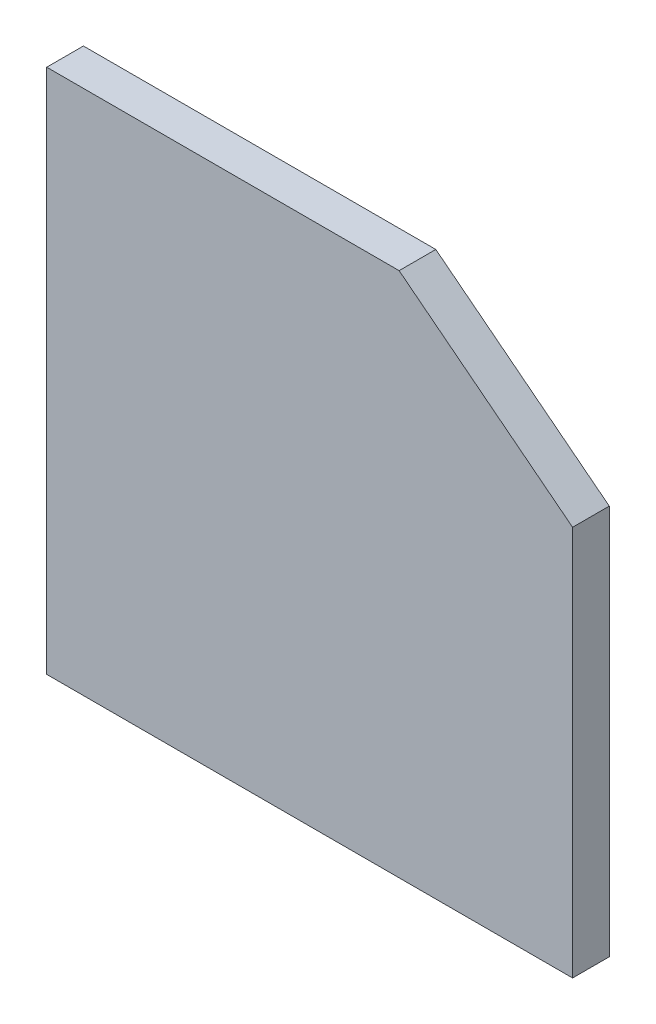
ISO-10303-21;
HEADER;
FILE_DESCRIPTION(('STEP AP214'),'2;1');
FILE_NAME('part.step','',(''),(''),'','','');
FILE_SCHEMA(('AUTOMOTIVE_DESIGN { 1 0 10303 214 1 1 1 1 }'));
ENDSEC;
DATA;
#1=APPLICATION_CONTEXT('core data for automotive mechanical design processes');
#2=APPLICATION_PROTOCOL_DEFINITION('international standard','automotive_design',2000,#1);
#3=PRODUCT_CONTEXT('',#1,'mechanical');
#4=PRODUCT('Part','Part','',(#3));
#5=PRODUCT_RELATED_PRODUCT_CATEGORY('part','',(#4));
#6=PRODUCT_DEFINITION_FORMATION('','',#4);
#7=PRODUCT_DEFINITION_CONTEXT('part definition',#1,'design');
#8=PRODUCT_DEFINITION('design','',#6,#7);
#9=PRODUCT_DEFINITION_SHAPE('','',#8);
#10=(LENGTH_UNIT() NAMED_UNIT(*) SI_UNIT(.MILLI.,.METRE.));
#11=(NAMED_UNIT(*) PLANE_ANGLE_UNIT() SI_UNIT($,.RADIAN.));
#12=(NAMED_UNIT(*) SI_UNIT($,.STERADIAN.) SOLID_ANGLE_UNIT());
#13=UNCERTAINTY_MEASURE_WITH_UNIT(LENGTH_MEASURE(1.E-05),#10,'distance_accuracy_value','');
#14=(GEOMETRIC_REPRESENTATION_CONTEXT(3) GLOBAL_UNCERTAINTY_ASSIGNED_CONTEXT((#13)) GLOBAL_UNIT_ASSIGNED_CONTEXT((#10,
#11,#12)) REPRESENTATION_CONTEXT('',''));
#15=CARTESIAN_POINT('',(0.,0.,0.));
#16=DIRECTION('',(0.,0.,1.));
#17=DIRECTION('',(1.,0.,0.));
#18=AXIS2_PLACEMENT_3D('',#15,#16,#17);
#19=CARTESIAN_POINT('',(0.,0.,3.));
#20=DIRECTION('',(0.,1.,0.));
#21=DIRECTION('',(0.,0.,1.));
#22=AXIS2_PLACEMENT_3D('',#19,#20,#21);
#23=PLANE('',#22);
#24=DIRECTION('',(1.,0.,0.));
#25=VECTOR('',#24,1.);
#26=CARTESIAN_POINT('',(0.,0.,0.));
#27=LINE('',#26,#25);
#28=CARTESIAN_POINT('',(0.,0.,0.));
#29=VERTEX_POINT('',#28);
#30=CARTESIAN_POINT('',(43.,0.,0.));
#31=VERTEX_POINT('',#30);
#32=EDGE_CURVE('E113',#29,#31,#27,.T.);
#33=ORIENTED_EDGE('',*,*,#32,.T.);
#34=DIRECTION('',(0.,0.,-1.));
#35=VECTOR('',#34,1.);
#36=CARTESIAN_POINT('',(43.,0.,3.));
#37=LINE('',#36,#35);
#38=CARTESIAN_POINT('',(43.,0.,3.));
#39=VERTEX_POINT('',#38);
#40=EDGE_CURVE('E11',#39,#31,#37,.T.);
#41=ORIENTED_EDGE('',*,*,#40,.F.);
#42=DIRECTION('',(1.,0.,0.));
#43=VECTOR('',#42,1.);
#44=CARTESIAN_POINT('',(0.,0.,3.));
#45=LINE('',#44,#43);
#46=CARTESIAN_POINT('',(0.,0.,3.));
#47=VERTEX_POINT('',#46);
#48=EDGE_CURVE('E124',#47,#39,#45,.T.);
#49=ORIENTED_EDGE('',*,*,#48,.F.);
#50=DIRECTION('',(0.,0.,-1.));
#51=VECTOR('',#50,1.);
#52=CARTESIAN_POINT('',(0.,0.,3.));
#53=LINE('',#52,#51);
#54=EDGE_CURVE('E55',#47,#29,#53,.T.);
#55=ORIENTED_EDGE('',*,*,#54,.T.);
#56=EDGE_LOOP('',(#33,#41,#49,#55));
#57=FACE_BOUND('',#56,.T.);
#58=ADVANCED_FACE('F39',(#57),#23,.F.);
#59=CARTESIAN_POINT('',(43.,0.,3.));
#60=DIRECTION('',(-1.,0.,0.));
#61=DIRECTION('',(0.,0.,1.));
#62=AXIS2_PLACEMENT_3D('',#59,#60,#61);
#63=PLANE('',#62);
#64=DIRECTION('',(0.,1.,0.));
#65=VECTOR('',#64,1.);
#66=CARTESIAN_POINT('',(43.,0.,0.));
#67=LINE('',#66,#65);
#68=CARTESIAN_POINT('',(43.,31.9180934441381,0.));
#69=VERTEX_POINT('',#68);
#70=EDGE_CURVE('E115',#31,#69,#67,.T.);
#71=ORIENTED_EDGE('',*,*,#70,.T.);
#72=DIRECTION('',(0.,0.,-1.));
#73=VECTOR('',#72,1.);
#74=CARTESIAN_POINT('',(43.,31.9180934441381,3.));
#75=LINE('',#74,#73);
#76=CARTESIAN_POINT('',(43.,31.9180934441381,3.));
#77=VERTEX_POINT('',#76);
#78=EDGE_CURVE('E47',#77,#69,#75,.T.);
#79=ORIENTED_EDGE('',*,*,#78,.F.);
#80=DIRECTION('',(0.,1.,0.));
#81=VECTOR('',#80,1.);
#82=CARTESIAN_POINT('',(43.,0.,3.));
#83=LINE('',#82,#81);
#84=EDGE_CURVE('E84',#39,#77,#83,.T.);
#85=ORIENTED_EDGE('',*,*,#84,.F.);
#86=ORIENTED_EDGE('',*,*,#40,.T.);
#87=EDGE_LOOP('',(#71,#79,#85,#86));
#88=FACE_BOUND('',#87,.T.);
#89=ADVANCED_FACE('F126',(#88),#63,.F.);
#90=CARTESIAN_POINT('',(31.7836740744698,40.6812476719696,3.));
#91=DIRECTION('',(0.615661475325659,0.788010753606721,0.));
#92=DIRECTION('',(-0.788010753606721,0.615661475325659,0.));
#93=AXIS2_PLACEMENT_3D('',#90,#91,#92);
#94=PLANE('',#93);
#95=DIRECTION('',(0.788010753606721,-0.615661475325659,0.));
#96=VECTOR('',#95,1.);
#97=CARTESIAN_POINT('',(31.7836740744698,40.6812476719696,0.));
#98=LINE('',#97,#96);
#99=CARTESIAN_POINT('',(28.815806435079,43.,0.));
#100=VERTEX_POINT('',#99);
#101=EDGE_CURVE('E96',#100,#69,#98,.T.);
#102=ORIENTED_EDGE('',*,*,#101,.F.);
#103=DIRECTION('',(0.,0.,-1.));
#104=VECTOR('',#103,1.);
#105=CARTESIAN_POINT('',(28.815806435079,43.,3.));
#106=LINE('',#105,#104);
#107=CARTESIAN_POINT('',(28.815806435079,43.,3.));
#108=VERTEX_POINT('',#107);
#109=EDGE_CURVE('E91',#108,#100,#106,.T.);
#110=ORIENTED_EDGE('',*,*,#109,.F.);
#111=DIRECTION('',(0.788010753606721,-0.615661475325659,0.));
#112=VECTOR('',#111,1.);
#113=CARTESIAN_POINT('',(31.7836740744698,40.6812476719696,3.));
#114=LINE('',#113,#112);
#115=EDGE_CURVE('E94',#108,#77,#114,.T.);
#116=ORIENTED_EDGE('',*,*,#115,.T.);
#117=ORIENTED_EDGE('',*,*,#78,.T.);
#118=EDGE_LOOP('',(#102,#110,#116,#117));
#119=FACE_BOUND('',#118,.T.);
#120=ADVANCED_FACE('F93',(#119),#94,.T.);
#121=CARTESIAN_POINT('',(0.,43.,3.));
#122=DIRECTION('',(0.,1.,0.));
#123=DIRECTION('',(0.,0.,1.));
#124=AXIS2_PLACEMENT_3D('',#121,#122,#123);
#125=PLANE('',#124);
#126=DIRECTION('',(1.,0.,0.));
#127=VECTOR('',#126,1.);
#128=CARTESIAN_POINT('',(0.,43.,0.));
#129=LINE('',#128,#127);
#130=CARTESIAN_POINT('',(0.,43.,0.));
#131=VERTEX_POINT('',#130);
#132=EDGE_CURVE('E119',#131,#100,#129,.T.);
#133=ORIENTED_EDGE('',*,*,#132,.F.);
#134=DIRECTION('',(0.,0.,-1.));
#135=VECTOR('',#134,1.);
#136=CARTESIAN_POINT('',(0.,43.,3.));
#137=LINE('',#136,#135);
#138=CARTESIAN_POINT('',(0.,43.,3.));
#139=VERTEX_POINT('',#138);
#140=EDGE_CURVE('E72',#139,#131,#137,.T.);
#141=ORIENTED_EDGE('',*,*,#140,.F.);
#142=DIRECTION('',(1.,0.,0.));
#143=VECTOR('',#142,1.);
#144=CARTESIAN_POINT('',(0.,43.,3.));
#145=LINE('',#144,#143);
#146=EDGE_CURVE('E105',#139,#108,#145,.T.);
#147=ORIENTED_EDGE('',*,*,#146,.T.);
#148=ORIENTED_EDGE('',*,*,#109,.T.);
#149=EDGE_LOOP('',(#133,#141,#147,#148));
#150=FACE_BOUND('',#149,.T.);
#151=ADVANCED_FACE('F107',(#150),#125,.T.);
#152=CARTESIAN_POINT('',(0.,0.,3.));
#153=DIRECTION('',(-1.,0.,0.));
#154=DIRECTION('',(0.,0.,1.));
#155=AXIS2_PLACEMENT_3D('',#152,#153,#154);
#156=PLANE('',#155);
#157=DIRECTION('',(0.,1.,0.));
#158=VECTOR('',#157,1.);
#159=CARTESIAN_POINT('',(0.,0.,0.));
#160=LINE('',#159,#158);
#161=EDGE_CURVE('E121',#29,#131,#160,.T.);
#162=ORIENTED_EDGE('',*,*,#161,.F.);
#163=ORIENTED_EDGE('',*,*,#54,.F.);
#164=DIRECTION('',(0.,1.,0.));
#165=VECTOR('',#164,1.);
#166=CARTESIAN_POINT('',(0.,0.,3.));
#167=LINE('',#166,#165);
#168=EDGE_CURVE('E108',#47,#139,#167,.T.);
#169=ORIENTED_EDGE('',*,*,#168,.T.);
#170=ORIENTED_EDGE('',*,*,#140,.T.);
#171=EDGE_LOOP('',(#162,#163,#169,#170));
#172=FACE_BOUND('',#171,.T.);
#173=ADVANCED_FACE('F130',(#172),#156,.T.);
#174=CARTESIAN_POINT('',(0.,0.,3.));
#175=DIRECTION('',(0.,0.,1.));
#176=DIRECTION('',(1.,0.,0.));
#177=AXIS2_PLACEMENT_3D('',#174,#175,#176);
#178=PLANE('',#177);
#179=ORIENTED_EDGE('',*,*,#48,.T.);
#180=ORIENTED_EDGE('',*,*,#84,.T.);
#181=ORIENTED_EDGE('',*,*,#115,.F.);
#182=ORIENTED_EDGE('',*,*,#146,.F.);
#183=ORIENTED_EDGE('',*,*,#168,.F.);
#184=EDGE_LOOP('',(#179,#180,#181,#182,#183));
#185=FACE_BOUND('',#184,.T.);
#186=ADVANCED_FACE('F103',(#185),#178,.T.);
#187=CARTESIAN_POINT('',(0.,0.,0.));
#188=DIRECTION('',(0.,0.,1.));
#189=DIRECTION('',(1.,0.,0.));
#190=AXIS2_PLACEMENT_3D('',#187,#188,#189);
#191=PLANE('',#190);
#192=ORIENTED_EDGE('',*,*,#32,.F.);
#193=ORIENTED_EDGE('',*,*,#161,.T.);
#194=ORIENTED_EDGE('',*,*,#132,.T.);
#195=ORIENTED_EDGE('',*,*,#101,.T.);
#196=ORIENTED_EDGE('',*,*,#70,.F.);
#197=EDGE_LOOP('',(#192,#193,#194,#195,#196));
#198=FACE_BOUND('',#197,.T.);
#199=ADVANCED_FACE('F129',(#198),#191,.F.);
#200=CLOSED_SHELL('',(#58,#89,#120,#151,#173,#186,#199));
#201=MANIFOLD_SOLID_BREP('B2',#200);
#202=ADVANCED_BREP_SHAPE_REPRESENTATION('',(#18,#201),#14);
#203=SHAPE_DEFINITION_REPRESENTATION(#9,#202);
ENDSEC;
END-ISO-10303-21;
